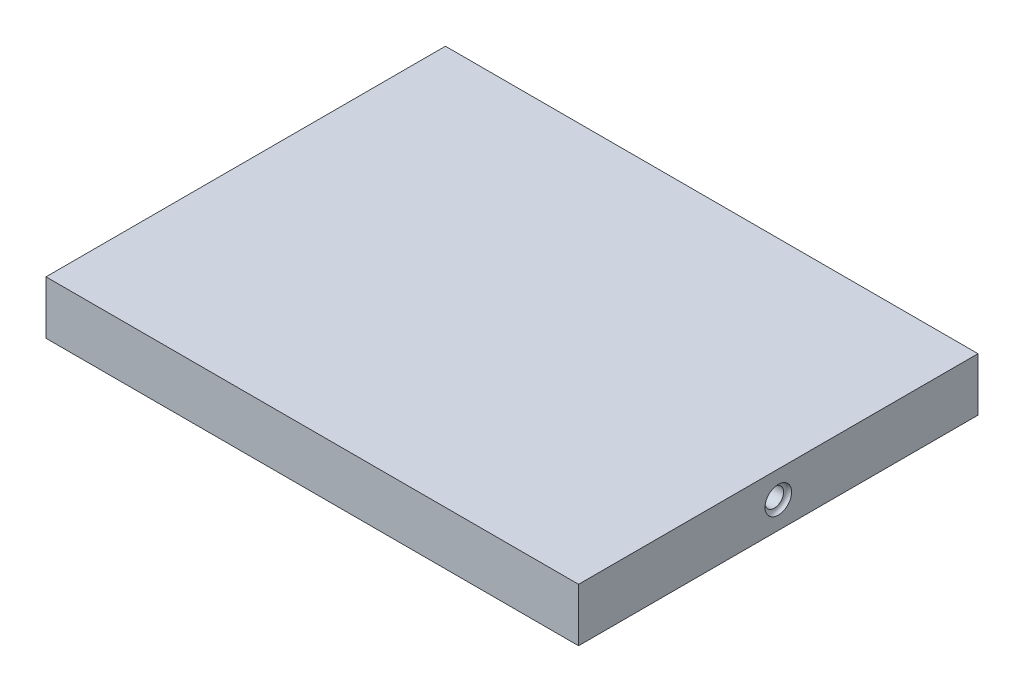
ISO-10303-21;
HEADER;
FILE_DESCRIPTION(('STEP AP214'),'2;1');
FILE_NAME('part.step','',(''),(''),'','','');
FILE_SCHEMA(('AUTOMOTIVE_DESIGN { 1 0 10303 214 1 1 1 1 }'));
ENDSEC;
DATA;
#1=APPLICATION_CONTEXT('core data for automotive mechanical design processes');
#2=APPLICATION_PROTOCOL_DEFINITION('international standard','automotive_design',2000,#1);
#3=PRODUCT_CONTEXT('',#1,'mechanical');
#4=PRODUCT('Part','Part','',(#3));
#5=PRODUCT_RELATED_PRODUCT_CATEGORY('part','',(#4));
#6=PRODUCT_DEFINITION_FORMATION('','',#4);
#7=PRODUCT_DEFINITION_CONTEXT('part definition',#1,'design');
#8=PRODUCT_DEFINITION('design','',#6,#7);
#9=PRODUCT_DEFINITION_SHAPE('','',#8);
#10=(LENGTH_UNIT() NAMED_UNIT(*) SI_UNIT(.MILLI.,.METRE.));
#11=(NAMED_UNIT(*) PLANE_ANGLE_UNIT() SI_UNIT($,.RADIAN.));
#12=(NAMED_UNIT(*) SI_UNIT($,.STERADIAN.) SOLID_ANGLE_UNIT());
#13=UNCERTAINTY_MEASURE_WITH_UNIT(LENGTH_MEASURE(1.E-05),#10,'distance_accuracy_value','');
#14=(GEOMETRIC_REPRESENTATION_CONTEXT(3) GLOBAL_UNCERTAINTY_ASSIGNED_CONTEXT((#13)) GLOBAL_UNIT_ASSIGNED_CONTEXT((#10,
#11,#12)) REPRESENTATION_CONTEXT('',''));
#15=CARTESIAN_POINT('',(0.,0.,0.));
#16=DIRECTION('',(0.,0.,1.));
#17=DIRECTION('',(1.,0.,0.));
#18=AXIS2_PLACEMENT_3D('',#15,#16,#17);
#19=CARTESIAN_POINT('',(10.,2.,-7.5));
#20=DIRECTION('',(-1.,0.,0.));
#21=DIRECTION('',(0.,0.,1.));
#22=AXIS2_PLACEMENT_3D('',#19,#20,#21);
#23=PLANE('',#22);
#24=CARTESIAN_POINT('',(10.,1.,0.));
#25=DIRECTION('',(-1.,0.,0.));
#26=DIRECTION('',(0.,0.,1.));
#27=AXIS2_PLACEMENT_3D('',#24,#25,#26);
#28=CIRCLE('',#27,0.5);
#29=CARTESIAN_POINT('',(10.,1.,0.5));
#30=VERTEX_POINT('',#29);
#31=EDGE_CURVE('E142',#30,#30,#28,.T.);
#32=ORIENTED_EDGE('',*,*,#31,.T.);
#33=EDGE_LOOP('',(#32));
#34=FACE_BOUND('',#33,.T.);
#35=DIRECTION('',(0.,0.,-1.));
#36=VECTOR('',#35,1.);
#37=CARTESIAN_POINT('',(10.,0.,-7.5));
#38=LINE('',#37,#36);
#39=CARTESIAN_POINT('',(10.,0.,7.5));
#40=VERTEX_POINT('',#39);
#41=CARTESIAN_POINT('',(10.,0.,-7.5));
#42=VERTEX_POINT('',#41);
#43=EDGE_CURVE('E108',#40,#42,#38,.T.);
#44=ORIENTED_EDGE('',*,*,#43,.T.);
#45=DIRECTION('',(0.,-1.,0.));
#46=VECTOR('',#45,1.);
#47=CARTESIAN_POINT('',(10.,2.,-7.5));
#48=LINE('',#47,#46);
#49=CARTESIAN_POINT('',(10.,2.,-7.5));
#50=VERTEX_POINT('',#49);
#51=EDGE_CURVE('E11',#50,#42,#48,.T.);
#52=ORIENTED_EDGE('',*,*,#51,.F.);
#53=DIRECTION('',(0.,0.,-1.));
#54=VECTOR('',#53,1.);
#55=CARTESIAN_POINT('',(10.,2.,-7.5));
#56=LINE('',#55,#54);
#57=CARTESIAN_POINT('',(10.,2.,7.5));
#58=VERTEX_POINT('',#57);
#59=EDGE_CURVE('E96',#58,#50,#56,.T.);
#60=ORIENTED_EDGE('',*,*,#59,.F.);
#61=DIRECTION('',(0.,-1.,0.));
#62=VECTOR('',#61,1.);
#63=CARTESIAN_POINT('',(10.,2.,7.5));
#64=LINE('',#63,#62);
#65=EDGE_CURVE('E104',#58,#40,#64,.T.);
#66=ORIENTED_EDGE('',*,*,#65,.T.);
#67=EDGE_LOOP('',(#44,#52,#60,#66));
#68=FACE_BOUND('',#67,.T.);
#69=ADVANCED_FACE('F45',(#34,#68),#23,.F.);
#70=CARTESIAN_POINT('',(-10.,2.,-7.5));
#71=DIRECTION('',(0.,0.,1.));
#72=DIRECTION('',(1.,0.,0.));
#73=AXIS2_PLACEMENT_3D('',#70,#71,#72);
#74=PLANE('',#73);
#75=DIRECTION('',(-1.,0.,0.));
#76=VECTOR('',#75,1.);
#77=CARTESIAN_POINT('',(-10.,0.,-7.5));
#78=LINE('',#77,#76);
#79=CARTESIAN_POINT('',(-10.,0.,-7.5));
#80=VERTEX_POINT('',#79);
#81=EDGE_CURVE('E100',#42,#80,#78,.T.);
#82=ORIENTED_EDGE('',*,*,#81,.T.);
#83=DIRECTION('',(0.,-1.,0.));
#84=VECTOR('',#83,1.);
#85=CARTESIAN_POINT('',(-10.,2.,-7.5));
#86=LINE('',#85,#84);
#87=CARTESIAN_POINT('',(-10.,2.,-7.5));
#88=VERTEX_POINT('',#87);
#89=EDGE_CURVE('E53',#88,#80,#86,.T.);
#90=ORIENTED_EDGE('',*,*,#89,.F.);
#91=DIRECTION('',(-1.,0.,0.));
#92=VECTOR('',#91,1.);
#93=CARTESIAN_POINT('',(-10.,2.,-7.5));
#94=LINE('',#93,#92);
#95=EDGE_CURVE('E91',#50,#88,#94,.T.);
#96=ORIENTED_EDGE('',*,*,#95,.F.);
#97=ORIENTED_EDGE('',*,*,#51,.T.);
#98=EDGE_LOOP('',(#82,#90,#96,#97));
#99=FACE_BOUND('',#98,.T.);
#100=ADVANCED_FACE('F99',(#99),#74,.F.);
#101=CARTESIAN_POINT('',(-10.,2.,-7.5));
#102=DIRECTION('',(1.,0.,0.));
#103=DIRECTION('',(0.,0.,-1.));
#104=AXIS2_PLACEMENT_3D('',#101,#102,#103);
#105=PLANE('',#104);
#106=CARTESIAN_POINT('',(-10.,1.,0.));
#107=DIRECTION('',(-1.,0.,0.));
#108=DIRECTION('',(0.,0.,1.));
#109=AXIS2_PLACEMENT_3D('',#106,#107,#108);
#110=CIRCLE('',#109,0.499999999999997);
#111=CARTESIAN_POINT('',(-10.,1.,0.499999999999997));
#112=VERTEX_POINT('',#111);
#113=EDGE_CURVE('E111',#112,#112,#110,.T.);
#114=ORIENTED_EDGE('',*,*,#113,.F.);
#115=EDGE_LOOP('',(#114));
#116=FACE_BOUND('',#115,.T.);
#117=DIRECTION('',(0.,0.,1.));
#118=VECTOR('',#117,1.);
#119=CARTESIAN_POINT('',(-10.,0.,-7.5));
#120=LINE('',#119,#118);
#121=CARTESIAN_POINT('',(-10.,0.,7.5));
#122=VERTEX_POINT('',#121);
#123=EDGE_CURVE('E78',#80,#122,#120,.T.);
#124=ORIENTED_EDGE('',*,*,#123,.T.);
#125=DIRECTION('',(0.,-1.,0.));
#126=VECTOR('',#125,1.);
#127=CARTESIAN_POINT('',(-10.,2.,7.5));
#128=LINE('',#127,#126);
#129=CARTESIAN_POINT('',(-10.,2.,7.5));
#130=VERTEX_POINT('',#129);
#131=EDGE_CURVE('E101',#130,#122,#128,.T.);
#132=ORIENTED_EDGE('',*,*,#131,.F.);
#133=DIRECTION('',(0.,0.,1.));
#134=VECTOR('',#133,1.);
#135=CARTESIAN_POINT('',(-10.,2.,-7.5));
#136=LINE('',#135,#134);
#137=EDGE_CURVE('E94',#88,#130,#136,.T.);
#138=ORIENTED_EDGE('',*,*,#137,.F.);
#139=ORIENTED_EDGE('',*,*,#89,.T.);
#140=EDGE_LOOP('',(#124,#132,#138,#139));
#141=FACE_BOUND('',#140,.T.);
#142=ADVANCED_FACE('F102',(#116,#141),#105,.F.);
#143=CARTESIAN_POINT('',(-10.,2.,7.5));
#144=DIRECTION('',(0.,0.,-1.));
#145=DIRECTION('',(-1.,0.,0.));
#146=AXIS2_PLACEMENT_3D('',#143,#144,#145);
#147=PLANE('',#146);
#148=DIRECTION('',(1.,0.,0.));
#149=VECTOR('',#148,1.);
#150=CARTESIAN_POINT('',(-10.,0.,7.5));
#151=LINE('',#150,#149);
#152=EDGE_CURVE('E84',#122,#40,#151,.T.);
#153=ORIENTED_EDGE('',*,*,#152,.T.);
#154=ORIENTED_EDGE('',*,*,#65,.F.);
#155=DIRECTION('',(1.,0.,0.));
#156=VECTOR('',#155,1.);
#157=CARTESIAN_POINT('',(-10.,2.,7.5));
#158=LINE('',#157,#156);
#159=EDGE_CURVE('E61',#130,#58,#158,.T.);
#160=ORIENTED_EDGE('',*,*,#159,.F.);
#161=ORIENTED_EDGE('',*,*,#131,.T.);
#162=EDGE_LOOP('',(#153,#154,#160,#161));
#163=FACE_BOUND('',#162,.T.);
#164=ADVANCED_FACE('F116',(#163),#147,.F.);
#165=CARTESIAN_POINT('',(0.,2.,0.));
#166=DIRECTION('',(0.,1.,0.));
#167=DIRECTION('',(0.,0.,1.));
#168=AXIS2_PLACEMENT_3D('',#165,#166,#167);
#169=PLANE('',#168);
#170=ORIENTED_EDGE('',*,*,#59,.T.);
#171=ORIENTED_EDGE('',*,*,#95,.T.);
#172=ORIENTED_EDGE('',*,*,#137,.T.);
#173=ORIENTED_EDGE('',*,*,#159,.T.);
#174=EDGE_LOOP('',(#170,#171,#172,#173));
#175=FACE_BOUND('',#174,.T.);
#176=ADVANCED_FACE('F92',(#175),#169,.T.);
#177=CARTESIAN_POINT('',(0.,0.,0.));
#178=DIRECTION('',(0.,1.,0.));
#179=DIRECTION('',(0.,0.,1.));
#180=AXIS2_PLACEMENT_3D('',#177,#178,#179);
#181=PLANE('',#180);
#182=ORIENTED_EDGE('',*,*,#43,.F.);
#183=ORIENTED_EDGE('',*,*,#152,.F.);
#184=ORIENTED_EDGE('',*,*,#123,.F.);
#185=ORIENTED_EDGE('',*,*,#81,.F.);
#186=EDGE_LOOP('',(#182,#183,#184,#185));
#187=FACE_BOUND('',#186,.T.);
#188=ADVANCED_FACE('F119',(#187),#181,.F.);
#189=CARTESIAN_POINT('',(-10.,1.,0.));
#190=DIRECTION('',(-1.,0.,0.));
#191=DIRECTION('',(0.,0.,1.));
#192=AXIS2_PLACEMENT_3D('',#189,#190,#191);
#193=TOROIDAL_SURFACE('',#192,0.349999999999998,0.15);
#194=ORIENTED_EDGE('',*,*,#113,.T.);
#195=EDGE_LOOP('',(#194));
#196=FACE_BOUND('',#195,.T.);
#197=CARTESIAN_POINT('',(-9.85,1.,0.));
#198=DIRECTION('',(-1.,0.,0.));
#199=DIRECTION('',(0.,0.,1.));
#200=AXIS2_PLACEMENT_3D('',#197,#198,#199);
#201=CIRCLE('',#200,0.349999999999998);
#202=CARTESIAN_POINT('',(-9.85,1.,0.349999999999998));
#203=VERTEX_POINT('',#202);
#204=EDGE_CURVE('E124',#203,#203,#201,.T.);
#205=ORIENTED_EDGE('',*,*,#204,.F.);
#206=EDGE_LOOP('',(#205));
#207=FACE_BOUND('',#206,.T.);
#208=ADVANCED_FACE('F172',(#196,#207),#193,.F.);
#209=CARTESIAN_POINT('',(-10.,1.,0.));
#210=DIRECTION('',(-1.,0.,0.));
#211=DIRECTION('',(0.,0.,1.));
#212=AXIS2_PLACEMENT_3D('',#209,#210,#211);
#213=CYLINDRICAL_SURFACE('',#212,0.349999999999998);
#214=ORIENTED_EDGE('',*,*,#204,.T.);
#215=EDGE_LOOP('',(#214));
#216=FACE_BOUND('',#215,.T.);
#217=CARTESIAN_POINT('',(-3.4,1.,0.));
#218=DIRECTION('',(-1.,0.,0.));
#219=DIRECTION('',(0.,0.,1.));
#220=AXIS2_PLACEMENT_3D('',#217,#218,#219);
#221=CIRCLE('',#220,0.349999999999999);
#222=CARTESIAN_POINT('',(-3.4,1.,0.349999999999999));
#223=VERTEX_POINT('',#222);
#224=EDGE_CURVE('E127',#223,#223,#221,.T.);
#225=ORIENTED_EDGE('',*,*,#224,.F.);
#226=EDGE_LOOP('',(#225));
#227=FACE_BOUND('',#226,.T.);
#228=ADVANCED_FACE('F177',(#216,#227),#213,.F.);
#229=CARTESIAN_POINT('',(-3.,1.,0.));
#230=DIRECTION('',(-1.,0.,0.));
#231=DIRECTION('',(0.,0.,1.));
#232=AXIS2_PLACEMENT_3D('',#229,#230,#231);
#233=DEGENERATE_TOROIDAL_SURFACE('',#232,0.349999999999999,0.4,.T.);
#234=ORIENTED_EDGE('',*,*,#224,.T.);
#235=EDGE_LOOP('',(#234));
#236=FACE_BOUND('',#235,.T.);
#237=CARTESIAN_POINT('',(-2.6,1.,0.));
#238=DIRECTION('',(-1.,0.,0.));
#239=DIRECTION('',(0.,0.,1.));
#240=AXIS2_PLACEMENT_3D('',#237,#238,#239);
#241=CIRCLE('',#240,0.349999999999998);
#242=CARTESIAN_POINT('',(-2.6,1.,0.349999999999998));
#243=VERTEX_POINT('',#242);
#244=EDGE_CURVE('E130',#243,#243,#241,.T.);
#245=ORIENTED_EDGE('',*,*,#244,.F.);
#246=EDGE_LOOP('',(#245));
#247=FACE_BOUND('',#246,.T.);
#248=ADVANCED_FACE('F181',(#236,#247),#233,.F.);
#249=CARTESIAN_POINT('',(-10.,1.,0.));
#250=DIRECTION('',(-1.,0.,0.));
#251=DIRECTION('',(0.,0.,1.));
#252=AXIS2_PLACEMENT_3D('',#249,#250,#251);
#253=CYLINDRICAL_SURFACE('',#252,0.349999999999998);
#254=ORIENTED_EDGE('',*,*,#244,.T.);
#255=EDGE_LOOP('',(#254));
#256=FACE_BOUND('',#255,.T.);
#257=CARTESIAN_POINT('',(2.6,1.,0.));
#258=DIRECTION('',(-1.,0.,0.));
#259=DIRECTION('',(0.,0.,1.));
#260=AXIS2_PLACEMENT_3D('',#257,#258,#259);
#261=CIRCLE('',#260,0.349999999999999);
#262=CARTESIAN_POINT('',(2.6,1.,0.349999999999999));
#263=VERTEX_POINT('',#262);
#264=EDGE_CURVE('E133',#263,#263,#261,.T.);
#265=ORIENTED_EDGE('',*,*,#264,.F.);
#266=EDGE_LOOP('',(#265));
#267=FACE_BOUND('',#266,.T.);
#268=ADVANCED_FACE('F185',(#256,#267),#253,.F.);
#269=CARTESIAN_POINT('',(3.,1.,0.));
#270=DIRECTION('',(-1.,0.,0.));
#271=DIRECTION('',(0.,0.,1.));
#272=AXIS2_PLACEMENT_3D('',#269,#270,#271);
#273=DEGENERATE_TOROIDAL_SURFACE('',#272,0.349999999999999,0.4,.T.);
#274=ORIENTED_EDGE('',*,*,#264,.T.);
#275=EDGE_LOOP('',(#274));
#276=FACE_BOUND('',#275,.T.);
#277=CARTESIAN_POINT('',(3.4,1.,0.));
#278=DIRECTION('',(-1.,0.,0.));
#279=DIRECTION('',(0.,0.,1.));
#280=AXIS2_PLACEMENT_3D('',#277,#278,#279);
#281=CIRCLE('',#280,0.349999999999999);
#282=CARTESIAN_POINT('',(3.4,1.,0.349999999999999));
#283=VERTEX_POINT('',#282);
#284=EDGE_CURVE('E136',#283,#283,#281,.T.);
#285=ORIENTED_EDGE('',*,*,#284,.F.);
#286=EDGE_LOOP('',(#285));
#287=FACE_BOUND('',#286,.T.);
#288=ADVANCED_FACE('F155',(#276,#287),#273,.F.);
#289=CARTESIAN_POINT('',(-10.,1.,0.));
#290=DIRECTION('',(-1.,0.,0.));
#291=DIRECTION('',(0.,0.,1.));
#292=AXIS2_PLACEMENT_3D('',#289,#290,#291);
#293=CYLINDRICAL_SURFACE('',#292,0.35);
#294=ORIENTED_EDGE('',*,*,#284,.T.);
#295=EDGE_LOOP('',(#294));
#296=FACE_BOUND('',#295,.T.);
#297=CARTESIAN_POINT('',(9.85,1.,0.));
#298=DIRECTION('',(-1.,0.,0.));
#299=DIRECTION('',(0.,0.,1.));
#300=AXIS2_PLACEMENT_3D('',#297,#298,#299);
#301=CIRCLE('',#300,0.35);
#302=CARTESIAN_POINT('',(9.85,1.,0.35));
#303=VERTEX_POINT('',#302);
#304=EDGE_CURVE('E139',#303,#303,#301,.T.);
#305=ORIENTED_EDGE('',*,*,#304,.F.);
#306=EDGE_LOOP('',(#305));
#307=FACE_BOUND('',#306,.T.);
#308=ADVANCED_FACE('F149',(#296,#307),#293,.F.);
#309=CARTESIAN_POINT('',(10.,1.,0.));
#310=DIRECTION('',(-1.,0.,0.));
#311=DIRECTION('',(0.,0.,1.));
#312=AXIS2_PLACEMENT_3D('',#309,#310,#311);
#313=TOROIDAL_SURFACE('',#312,0.35,0.15);
#314=ORIENTED_EDGE('',*,*,#304,.T.);
#315=EDGE_LOOP('',(#314));
#316=FACE_BOUND('',#315,.T.);
#317=ORIENTED_EDGE('',*,*,#31,.F.);
#318=EDGE_LOOP('',(#317));
#319=FACE_BOUND('',#318,.T.);
#320=ADVANCED_FACE('F147',(#316,#319),#313,.F.);
#321=CLOSED_SHELL('',(#69,#100,#142,#164,#176,#188,#208,#228,#248,#268,#288,#308,#320));
#322=MANIFOLD_SOLID_BREP('B2',#321);
#323=ADVANCED_BREP_SHAPE_REPRESENTATION('',(#18,#322),#14);
#324=SHAPE_DEFINITION_REPRESENTATION(#9,#323);
ENDSEC;
END-ISO-10303-21;
